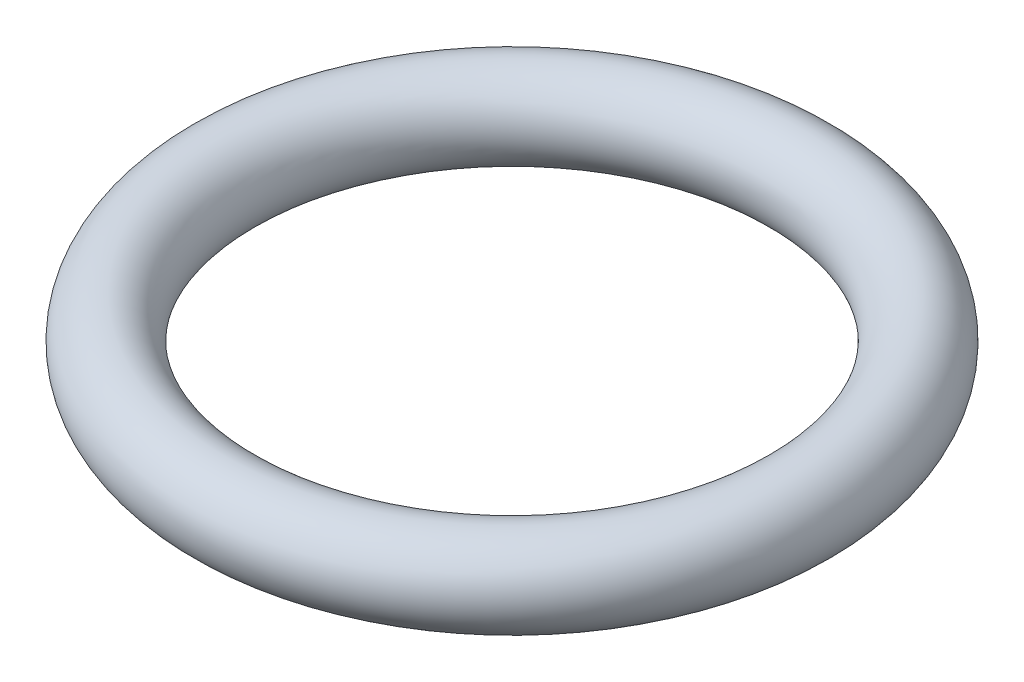
ISO-10303-21;
HEADER;
FILE_DESCRIPTION(('STEP AP214'),'2;1');
FILE_NAME('part.step','',(''),(''),'','','');
FILE_SCHEMA(('AUTOMOTIVE_DESIGN { 1 0 10303 214 1 1 1 1 }'));
ENDSEC;
DATA;
#1=APPLICATION_CONTEXT('core data for automotive mechanical design processes');
#2=APPLICATION_PROTOCOL_DEFINITION('international standard','automotive_design',2000,#1);
#3=PRODUCT_CONTEXT('',#1,'mechanical');
#4=PRODUCT('Part','Part','',(#3));
#5=PRODUCT_RELATED_PRODUCT_CATEGORY('part','',(#4));
#6=PRODUCT_DEFINITION_FORMATION('','',#4);
#7=PRODUCT_DEFINITION_CONTEXT('part definition',#1,'design');
#8=PRODUCT_DEFINITION('design','',#6,#7);
#9=PRODUCT_DEFINITION_SHAPE('','',#8);
#10=(LENGTH_UNIT() NAMED_UNIT(*) SI_UNIT(.MILLI.,.METRE.));
#11=(NAMED_UNIT(*) PLANE_ANGLE_UNIT() SI_UNIT($,.RADIAN.));
#12=(NAMED_UNIT(*) SI_UNIT($,.STERADIAN.) SOLID_ANGLE_UNIT());
#13=UNCERTAINTY_MEASURE_WITH_UNIT(LENGTH_MEASURE(1.E-05),#10,'distance_accuracy_value','');
#14=(GEOMETRIC_REPRESENTATION_CONTEXT(3) GLOBAL_UNCERTAINTY_ASSIGNED_CONTEXT((#13)) GLOBAL_UNIT_ASSIGNED_CONTEXT((#10,
#11,#12)) REPRESENTATION_CONTEXT('',''));
#15=CARTESIAN_POINT('',(0.,0.,0.));
#16=DIRECTION('',(0.,0.,1.));
#17=DIRECTION('',(1.,0.,0.));
#18=AXIS2_PLACEMENT_3D('',#15,#16,#17);
#19=CARTESIAN_POINT('',(0.,0.,0.));
#20=DIRECTION('',(0.,-1.,0.));
#21=DIRECTION('',(1.,0.,0.));
#22=AXIS2_PLACEMENT_3D('',#19,#20,#21);
#23=TOROIDAL_SURFACE('',#22,5.3848,0.79375);
#24=CARTESIAN_POINT('',(6.17855,0.,0.));
#25=VERTEX_POINT('',#24);
#26=VERTEX_LOOP('',#25);
#27=FACE_BOUND('',#26,.T.);
#28=ADVANCED_FACE('F41',(#27),#23,.T.);
#29=CLOSED_SHELL('',(#28));
#30=MANIFOLD_SOLID_BREP('B2',#29);
#31=ADVANCED_BREP_SHAPE_REPRESENTATION('',(#18,#30),#14);
#32=SHAPE_DEFINITION_REPRESENTATION(#9,#31);
ENDSEC;
END-ISO-10303-21;
